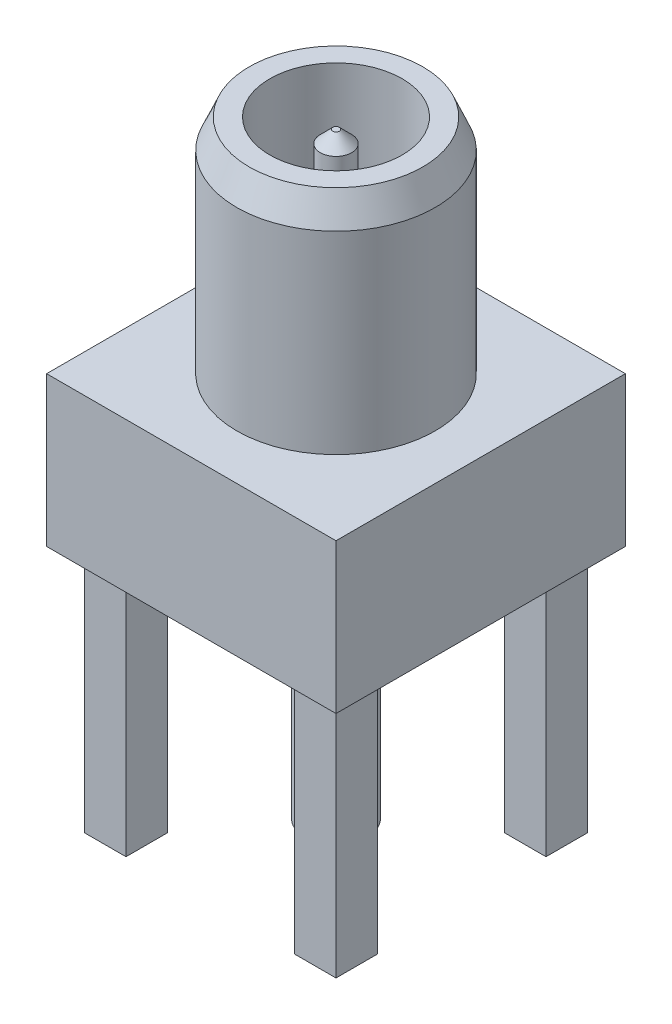
ISO-10303-21;
HEADER;
FILE_DESCRIPTION(('STEP AP214'),'2;1');
FILE_NAME('part.step','',(''),(''),'','','');
FILE_SCHEMA(('AUTOMOTIVE_DESIGN { 1 0 10303 214 1 1 1 1 }'));
ENDSEC;
DATA;
#1=APPLICATION_CONTEXT('core data for automotive mechanical design processes');
#2=APPLICATION_PROTOCOL_DEFINITION('international standard','automotive_design',2000,#1);
#3=PRODUCT_CONTEXT('',#1,'mechanical');
#4=PRODUCT('Part','Part','',(#3));
#5=PRODUCT_RELATED_PRODUCT_CATEGORY('part','',(#4));
#6=PRODUCT_DEFINITION_FORMATION('','',#4);
#7=PRODUCT_DEFINITION_CONTEXT('part definition',#1,'design');
#8=PRODUCT_DEFINITION('design','',#6,#7);
#9=PRODUCT_DEFINITION_SHAPE('','',#8);
#10=(LENGTH_UNIT() NAMED_UNIT(*) SI_UNIT(.MILLI.,.METRE.));
#11=(NAMED_UNIT(*) PLANE_ANGLE_UNIT() SI_UNIT($,.RADIAN.));
#12=(NAMED_UNIT(*) SI_UNIT($,.STERADIAN.) SOLID_ANGLE_UNIT());
#13=UNCERTAINTY_MEASURE_WITH_UNIT(LENGTH_MEASURE(1.E-05),#10,'distance_accuracy_value','');
#14=(GEOMETRIC_REPRESENTATION_CONTEXT(3) GLOBAL_UNCERTAINTY_ASSIGNED_CONTEXT((#13)) GLOBAL_UNIT_ASSIGNED_CONTEXT((#10,
#11,#12)) REPRESENTATION_CONTEXT('',''));
#15=CARTESIAN_POINT('',(0.,0.,0.));
#16=DIRECTION('',(0.,0.,1.));
#17=DIRECTION('',(1.,0.,0.));
#18=AXIS2_PLACEMENT_3D('',#15,#16,#17);
#19=CARTESIAN_POINT('',(0.,-3.,0.));
#20=DIRECTION('',(0.,-1.,0.));
#21=DIRECTION('',(0.,0.,-1.));
#22=AXIS2_PLACEMENT_3D('',#19,#20,#21);
#23=PLANE('',#22);
#24=CARTESIAN_POINT('',(0.,-3.00000000004275,0.));
#25=DIRECTION('',(0.,1.,0.));
#26=DIRECTION('',(0.,0.,1.));
#27=AXIS2_PLACEMENT_3D('',#24,#25,#26);
#28=CIRCLE('',#27,0.231000000042059);
#29=CARTESIAN_POINT('',(0.,-3.00000000004275,0.231000000042059));
#30=VERTEX_POINT('',#29);
#31=EDGE_CURVE('E20',#30,#30,#28,.T.);
#32=ORIENTED_EDGE('',*,*,#31,.F.);
#33=EDGE_LOOP('',(#32));
#34=FACE_BOUND('',#33,.T.);
#35=ADVANCED_FACE('F17',(#34),#23,.T.);
#36=CARTESIAN_POINT('',(0.,-2.85000000013724,0.));
#37=DIRECTION('',(0.,1.,0.));
#38=DIRECTION('',(0.,0.,1.));
#39=AXIS2_PLACEMENT_3D('',#36,#37,#38);
#40=CONICAL_SURFACE('',#39,0.380999999947562,0.785398163397448);
#41=ORIENTED_EDGE('',*,*,#31,.T.);
#42=EDGE_LOOP('',(#41));
#43=FACE_BOUND('',#42,.T.);
#44=CARTESIAN_POINT('',(0.,-2.85,0.));
#45=DIRECTION('',(0.,1.,0.));
#46=DIRECTION('',(0.,0.,1.));
#47=AXIS2_PLACEMENT_3D('',#44,#45,#46);
#48=CIRCLE('',#47,0.381);
#49=CARTESIAN_POINT('',(0.,-2.85,0.381));
#50=VERTEX_POINT('',#49);
#51=EDGE_CURVE('E189',#50,#50,#48,.T.);
#52=ORIENTED_EDGE('',*,*,#51,.F.);
#53=EDGE_LOOP('',(#52));
#54=FACE_BOUND('',#53,.T.);
#55=ADVANCED_FACE('F766',(#43,#54),#40,.T.);
#56=CARTESIAN_POINT('',(-7.39999999999999,4.37,0.));
#57=DIRECTION('',(0.,1.,0.));
#58=DIRECTION('',(0.,0.,1.));
#59=AXIS2_PLACEMENT_3D('',#56,#57,#58);
#60=PLANE('',#59);
#61=CARTESIAN_POINT('',(0.,4.36999999999443,0.));
#62=DIRECTION('',(0.,-1.,0.));
#63=DIRECTION('',(0.,0.,-1.));
#64=AXIS2_PLACEMENT_3D('',#61,#62,#63);
#65=CIRCLE('',#64,0.0404999999542125);
#66=CARTESIAN_POINT('',(0.,4.36999999999443,-0.040499999954212));
#67=VERTEX_POINT('',#66);
#68=EDGE_CURVE('E177',#67,#67,#65,.T.);
#69=ORIENTED_EDGE('',*,*,#68,.F.);
#70=EDGE_LOOP('',(#69));
#71=FACE_BOUND('',#70,.T.);
#72=ADVANCED_FACE('F756',(#71),#60,.T.);
#73=CARTESIAN_POINT('',(-1.52,-3.,-1.52000000000002));
#74=DIRECTION('',(1.,0.,0.));
#75=DIRECTION('',(0.,0.,-1.));
#76=AXIS2_PLACEMENT_3D('',#73,#74,#75);
#77=PLANE('',#76);
#78=DIRECTION('',(0.,1.,0.));
#79=VECTOR('',#78,1.);
#80=CARTESIAN_POINT('',(-1.52,-3.,-1.52000000000002));
#81=LINE('',#80,#79);
#82=CARTESIAN_POINT('',(-1.52,0.,-1.52000000000002));
#83=VERTEX_POINT('',#82);
#84=CARTESIAN_POINT('',(-1.52,-3.,-1.52000000000002));
#85=VERTEX_POINT('',#84);
#86=EDGE_CURVE('E152',#83,#85,#81,.F.);
#87=ORIENTED_EDGE('',*,*,#86,.T.);
#88=DIRECTION('',(0.,0.,-1.));
#89=VECTOR('',#88,1.);
#90=CARTESIAN_POINT('',(-1.52,-3.,0.));
#91=LINE('',#90,#89);
#92=CARTESIAN_POINT('',(-1.52,-3.,-1.02000000000002));
#93=VERTEX_POINT('',#92);
#94=EDGE_CURVE('E171',#93,#85,#91,.T.);
#95=ORIENTED_EDGE('',*,*,#94,.F.);
#96=DIRECTION('',(0.,1.,0.));
#97=VECTOR('',#96,1.);
#98=CARTESIAN_POINT('',(-1.52,-3.,-1.02000000000002));
#99=LINE('',#98,#97);
#100=CARTESIAN_POINT('',(-1.52,0.,-1.02000000000002));
#101=VERTEX_POINT('',#100);
#102=EDGE_CURVE('E159',#93,#101,#99,.T.);
#103=ORIENTED_EDGE('',*,*,#102,.T.);
#104=DIRECTION('',(0.,0.,-1.));
#105=VECTOR('',#104,1.);
#106=CARTESIAN_POINT('',(-1.52,0.,-1.52000000000002));
#107=LINE('',#106,#105);
#108=EDGE_CURVE('E155',#83,#101,#107,.F.);
#109=ORIENTED_EDGE('',*,*,#108,.F.);
#110=EDGE_LOOP('',(#87,#95,#103,#109));
#111=FACE_BOUND('',#110,.T.);
#112=ADVANCED_FACE('F157',(#111),#77,.F.);
#113=CARTESIAN_POINT('',(-1.52000000000001,-3.,1.01999999999998));
#114=DIRECTION('',(1.,0.,0.));
#115=DIRECTION('',(0.,0.,-1.));
#116=AXIS2_PLACEMENT_3D('',#113,#114,#115);
#117=PLANE('',#116);
#118=DIRECTION('',(0.,1.,0.));
#119=VECTOR('',#118,1.);
#120=CARTESIAN_POINT('',(-1.52000000000001,-3.,1.01999999999998));
#121=LINE('',#120,#119);
#122=CARTESIAN_POINT('',(-1.52000000000001,0.,1.01999999999998));
#123=VERTEX_POINT('',#122);
#124=CARTESIAN_POINT('',(-1.52000000000001,-3.,1.01999999999998));
#125=VERTEX_POINT('',#124);
#126=EDGE_CURVE('E272',#123,#125,#121,.F.);
#127=ORIENTED_EDGE('',*,*,#126,.T.);
#128=DIRECTION('',(0.,0.,-1.));
#129=VECTOR('',#128,1.);
#130=CARTESIAN_POINT('',(-1.52000000000001,-3.,0.));
#131=LINE('',#130,#129);
#132=CARTESIAN_POINT('',(-1.52000000000001,-3.,1.51999999999998));
#133=VERTEX_POINT('',#132);
#134=EDGE_CURVE('E266',#133,#125,#131,.T.);
#135=ORIENTED_EDGE('',*,*,#134,.F.);
#136=DIRECTION('',(0.,1.,0.));
#137=VECTOR('',#136,1.);
#138=CARTESIAN_POINT('',(-1.52000000000001,-3.,1.51999999999998));
#139=LINE('',#138,#137);
#140=CARTESIAN_POINT('',(-1.52000000000001,0.,1.51999999999998));
#141=VERTEX_POINT('',#140);
#142=EDGE_CURVE('E257',#133,#141,#139,.T.);
#143=ORIENTED_EDGE('',*,*,#142,.T.);
#144=DIRECTION('',(0.,0.,-1.));
#145=VECTOR('',#144,1.);
#146=CARTESIAN_POINT('',(-1.52000000000001,0.,1.01999999999998));
#147=LINE('',#146,#145);
#148=EDGE_CURVE('E162',#123,#141,#147,.F.);
#149=ORIENTED_EDGE('',*,*,#148,.F.);
#150=EDGE_LOOP('',(#127,#135,#143,#149));
#151=FACE_BOUND('',#150,.T.);
#152=ADVANCED_FACE('F736',(#151),#117,.F.);
#153=CARTESIAN_POINT('',(1.01999999999999,-3.,1.02));
#154=DIRECTION('',(1.,0.,0.));
#155=DIRECTION('',(0.,0.,-1.));
#156=AXIS2_PLACEMENT_3D('',#153,#154,#155);
#157=PLANE('',#156);
#158=DIRECTION('',(0.,1.,0.));
#159=VECTOR('',#158,1.);
#160=CARTESIAN_POINT('',(1.01999999999999,-3.,1.02));
#161=LINE('',#160,#159);
#162=CARTESIAN_POINT('',(1.01999999999999,0.,1.02));
#163=VERTEX_POINT('',#162);
#164=CARTESIAN_POINT('',(1.01999999999999,-3.,1.02));
#165=VERTEX_POINT('',#164);
#166=EDGE_CURVE('E253',#163,#165,#161,.F.);
#167=ORIENTED_EDGE('',*,*,#166,.T.);
#168=DIRECTION('',(0.,0.,-1.));
#169=VECTOR('',#168,1.);
#170=CARTESIAN_POINT('',(1.01999999999999,-3.,0.));
#171=LINE('',#170,#169);
#172=CARTESIAN_POINT('',(1.01999999999999,-3.,1.52));
#173=VERTEX_POINT('',#172);
#174=EDGE_CURVE('E247',#173,#165,#171,.T.);
#175=ORIENTED_EDGE('',*,*,#174,.F.);
#176=DIRECTION('',(0.,1.,0.));
#177=VECTOR('',#176,1.);
#178=CARTESIAN_POINT('',(1.01999999999999,-3.,1.52));
#179=LINE('',#178,#177);
#180=CARTESIAN_POINT('',(1.01999999999999,0.,1.52));
#181=VERTEX_POINT('',#180);
#182=EDGE_CURVE('E231',#173,#181,#179,.T.);
#183=ORIENTED_EDGE('',*,*,#182,.T.);
#184=DIRECTION('',(0.,0.,-1.));
#185=VECTOR('',#184,1.);
#186=CARTESIAN_POINT('',(1.01999999999999,0.,1.02));
#187=LINE('',#186,#185);
#188=EDGE_CURVE('E190',#163,#181,#187,.F.);
#189=ORIENTED_EDGE('',*,*,#188,.F.);
#190=EDGE_LOOP('',(#167,#175,#183,#189));
#191=FACE_BOUND('',#190,.T.);
#192=ADVANCED_FACE('F370',(#191),#157,.F.);
#193=CARTESIAN_POINT('',(0.,-3.,0.));
#194=DIRECTION('',(0.,1.,0.));
#195=DIRECTION('',(0.,0.,1.));
#196=AXIS2_PLACEMENT_3D('',#193,#194,#195);
#197=CYLINDRICAL_SURFACE('',#196,0.381);
#198=CARTESIAN_POINT('',(0.,0.00100000000000013,0.));
#199=DIRECTION('',(0.,1.,0.));
#200=DIRECTION('',(0.,0.,1.));
#201=AXIS2_PLACEMENT_3D('',#198,#199,#200);
#202=CIRCLE('',#201,0.381);
#203=CARTESIAN_POINT('',(0.,0.00100000000000013,0.381));
#204=VERTEX_POINT('',#203);
#205=EDGE_CURVE('E223',#204,#204,#202,.T.);
#206=ORIENTED_EDGE('',*,*,#205,.F.);
#207=EDGE_LOOP('',(#206));
#208=FACE_BOUND('',#207,.T.);
#209=ORIENTED_EDGE('',*,*,#51,.T.);
#210=EDGE_LOOP('',(#209));
#211=FACE_BOUND('',#210,.T.);
#212=ADVANCED_FACE('F716',(#208,#211),#197,.T.);
#213=CARTESIAN_POINT('',(1.02,-3.,-1.52));
#214=DIRECTION('',(1.,0.,0.));
#215=DIRECTION('',(0.,0.,-1.));
#216=AXIS2_PLACEMENT_3D('',#213,#214,#215);
#217=PLANE('',#216);
#218=DIRECTION('',(0.,1.,0.));
#219=VECTOR('',#218,1.);
#220=CARTESIAN_POINT('',(1.02,-3.,-1.52));
#221=LINE('',#220,#219);
#222=CARTESIAN_POINT('',(1.02,0.,-1.52));
#223=VERTEX_POINT('',#222);
#224=CARTESIAN_POINT('',(1.02,-3.,-1.52));
#225=VERTEX_POINT('',#224);
#226=EDGE_CURVE('E225',#223,#225,#221,.F.);
#227=ORIENTED_EDGE('',*,*,#226,.T.);
#228=DIRECTION('',(0.,0.,-1.));
#229=VECTOR('',#228,1.);
#230=CARTESIAN_POINT('',(1.02,-3.,0.));
#231=LINE('',#230,#229);
#232=CARTESIAN_POINT('',(1.02,-3.,-1.02));
#233=VERTEX_POINT('',#232);
#234=EDGE_CURVE('E328',#233,#225,#231,.T.);
#235=ORIENTED_EDGE('',*,*,#234,.F.);
#236=DIRECTION('',(0.,1.,0.));
#237=VECTOR('',#236,1.);
#238=CARTESIAN_POINT('',(1.02,-3.,-1.02));
#239=LINE('',#238,#237);
#240=CARTESIAN_POINT('',(1.02,0.,-1.02));
#241=VERTEX_POINT('',#240);
#242=EDGE_CURVE('E319',#233,#241,#239,.T.);
#243=ORIENTED_EDGE('',*,*,#242,.T.);
#244=DIRECTION('',(0.,0.,-1.));
#245=VECTOR('',#244,1.);
#246=CARTESIAN_POINT('',(1.02,0.,-1.52));
#247=LINE('',#246,#245);
#248=EDGE_CURVE('E180',#223,#241,#247,.F.);
#249=ORIENTED_EDGE('',*,*,#248,.F.);
#250=EDGE_LOOP('',(#227,#235,#243,#249));
#251=FACE_BOUND('',#250,.T.);
#252=ADVANCED_FACE('F341',(#251),#217,.F.);
#253=CARTESIAN_POINT('',(0.,4.22000083335661,0.));
#254=DIRECTION('',(0.,-1.,0.));
#255=DIRECTION('',(0.,0.,-1.));
#256=AXIS2_PLACEMENT_3D('',#253,#254,#255);
#257=CONICAL_SURFACE('',#256,0.1899999999182,0.783731493612322);
#258=CARTESIAN_POINT('',(0.,4.22000083333565,0.));
#259=DIRECTION('',(0.,-1.,0.));
#260=DIRECTION('',(0.,0.,-1.));
#261=AXIS2_PLACEMENT_3D('',#258,#259,#260);
#262=CIRCLE('',#261,0.19);
#263=CARTESIAN_POINT('',(0.,4.22000083333565,-0.189999999939087));
#264=VERTEX_POINT('',#263);
#265=EDGE_CURVE('E183',#264,#264,#262,.T.);
#266=CARTESIAN_POINT('',(0.,4.22000083333565,-0.189999999939087));
#267=CARTESIAN_POINT('',(0.,4.22156332465501,-0.188442708272578));
#268=CARTESIAN_POINT('',(0.,4.22312581597437,-0.186885416606069));
#269=CARTESIAN_POINT('',(0.,4.2262507986131,-0.183770833273051));
#270=CARTESIAN_POINT('',(0.,4.22781328993246,-0.182213541606542));
#271=CARTESIAN_POINT('',(0.,4.23093827257119,-0.179098958273523));
#272=CARTESIAN_POINT('',(0.,4.23250076389055,-0.177541666607014));
#273=CARTESIAN_POINT('',(0.,4.23562574652927,-0.174427083273996));
#274=CARTESIAN_POINT('',(0.,4.23718823784864,-0.172869791607487));
#275=CARTESIAN_POINT('',(0.,4.24031322048736,-0.169755208274469));
#276=CARTESIAN_POINT('',(0.,4.24187571180672,-0.168197916607959));
#277=CARTESIAN_POINT('',(0.,4.24500069444545,-0.165083333274941));
#278=CARTESIAN_POINT('',(0.,4.24656318576481,-0.163526041608432));
#279=CARTESIAN_POINT('',(0.,4.24968816840353,-0.160411458275414));
#280=CARTESIAN_POINT('',(0.,4.2512506597229,-0.158854166608905));
#281=CARTESIAN_POINT('',(0.,4.25437564236162,-0.155739583275887));
#282=CARTESIAN_POINT('',(0.,4.25593813368098,-0.154182291609377));
#283=CARTESIAN_POINT('',(0.,4.25906311631971,-0.151067708276359));
#284=CARTESIAN_POINT('',(0.,4.26062560763907,-0.14951041660985));
#285=CARTESIAN_POINT('',(0.,4.2637505902778,-0.146395833276832));
#286=CARTESIAN_POINT('',(0.,4.26531308159716,-0.144838541610323));
#287=CARTESIAN_POINT('',(0.,4.26843806423588,-0.141723958277304));
#288=CARTESIAN_POINT('',(0.,4.27000055555525,-0.140166666610795));
#289=CARTESIAN_POINT('',(0.,4.27312553819397,-0.137052083277777));
#290=CARTESIAN_POINT('',(0.,4.27468802951333,-0.135494791611268));
#291=CARTESIAN_POINT('',(0.,4.27781301215206,-0.13238020827825));
#292=CARTESIAN_POINT('',(0.,4.27937550347142,-0.130822916611741));
#293=CARTESIAN_POINT('',(0.,4.28250048611014,-0.127708333278722));
#294=CARTESIAN_POINT('',(0.,4.28406297742951,-0.126151041612213));
#295=CARTESIAN_POINT('',(0.,4.28718796006823,-0.123036458279195));
#296=CARTESIAN_POINT('',(0.,4.28875045138759,-0.121479166612686));
#297=CARTESIAN_POINT('',(0.,4.29187543402632,-0.118364583279668));
#298=CARTESIAN_POINT('',(0.,4.29343792534568,-0.116807291613159));
#299=CARTESIAN_POINT('',(0.,4.2965629079844,-0.113692708280141));
#300=CARTESIAN_POINT('',(0.,4.29812539930377,-0.112135416613631));
#301=CARTESIAN_POINT('',(0.,4.30125038194249,-0.109020833280613));
#302=CARTESIAN_POINT('',(0.,4.30281287326186,-0.107463541614104));
#303=CARTESIAN_POINT('',(0.,4.30593785590058,-0.104348958281086));
#304=CARTESIAN_POINT('',(0.,4.30750034721994,-0.102791666614577));
#305=CARTESIAN_POINT('',(0.,4.31062532985867,-0.0996770832815584));
#306=CARTESIAN_POINT('',(0.,4.31218782117803,-0.0981197916150493));
#307=CARTESIAN_POINT('',(0.,4.31531280381675,-0.095005208282031));
#308=CARTESIAN_POINT('',(0.,4.31687529513612,-0.0934479166155219));
#309=CARTESIAN_POINT('',(0.,4.32000027777484,-0.0903333332825037));
#310=CARTESIAN_POINT('',(0.,4.3215627690942,-0.0887760416159946));
#311=CARTESIAN_POINT('',(0.,4.32468775173293,-0.0856614582829763));
#312=CARTESIAN_POINT('',(0.,4.32625024305229,-0.0841041666164672));
#313=CARTESIAN_POINT('',(0.,4.32937522569101,-0.080989583283449));
#314=CARTESIAN_POINT('',(0.,4.33093771701038,-0.0794322916169399));
#315=CARTESIAN_POINT('',(0.,4.3340626996491,-0.0763177082839217));
#316=CARTESIAN_POINT('',(0.,4.33562519096846,-0.0747604166174125));
#317=CARTESIAN_POINT('',(0.,4.33875017360719,-0.0716458332843943));
#318=CARTESIAN_POINT('',(0.,4.34031266492655,-0.0700885416178852));
#319=CARTESIAN_POINT('',(0.,4.34343764756527,-0.066973958284867));
#320=CARTESIAN_POINT('',(0.,4.34500013888464,-0.0654166666183579));
#321=CARTESIAN_POINT('',(0.,4.34812512152336,-0.0623020832853396));
#322=CARTESIAN_POINT('',(0.,4.34968761284272,-0.0607447916188305));
#323=CARTESIAN_POINT('',(0.,4.35281259548145,-0.0576302082858123));
#324=CARTESIAN_POINT('',(0.,4.35437508680081,-0.0560729166193032));
#325=CARTESIAN_POINT('',(0.,4.35750006943953,-0.0529583332862849));
#326=CARTESIAN_POINT('',(0.,4.3590625607589,-0.0514010416197758));
#327=CARTESIAN_POINT('',(0.,4.36218754339762,-0.0482864582867576));
#328=CARTESIAN_POINT('',(0.,4.36375003471699,-0.0467291666202485));
#329=CARTESIAN_POINT('',(0.,4.36687501735571,-0.0436145832872302));
#330=CARTESIAN_POINT('',(0.,4.36843750867507,-0.0420572916207211));
#331=CARTESIAN_POINT('',(0.,4.36999999999443,-0.040499999954212));
#332=B_SPLINE_CURVE_WITH_KNOTS('',3,(#266,#267,#268,#269,#270,#271,#272,#273,#274,#275,#276,
#277,#278,#279,#280,#281,#282,#283,#284,#285,#286,#287,#288,#289,#290,#291,#292,#293,#294,#295,
#296,#297,#298,#299,#300,#301,#302,#303,#304,#305,#306,#307,#308,#309,#310,#311,#312,#313,#314,
#315,#316,#317,#318,#319,#320,#321,#322,#323,#324,#325,#326,#327,#328,#329,#330,#331),
.UNSPECIFIED.,.F.,.F.,(4,2,2,2,2,2,2,2,2,2,2,2,2,2,2,2,2,2,2,2,2,2,2,2,2,2,2,2,2,2,2,2,4),(0.,
0.00661806830721473,0.0132361366144288,0.0198542049216429,0.026472273228857,0.0330903415360712,
0.0397084098432853,0.0463264781504994,0.0529445464577135,0.0595626147649276,0.0661806830721417,
0.0727987513793558,0.0794168196865699,0.086034887993784,0.0926529563009982,0.0992710246082123,
0.105889092915427,0.112507161222641,0.119125229529855,0.125743297837069,0.132361366144283,
0.138979434451498,0.145597502758712,0.152215571065926,0.15883363937314,0.165451707680354,
0.172069775987568,0.178687844294782,0.185305912601996,0.19192398090921,0.198542049216425,
0.205160117523639,0.211778185830853),.UNSPECIFIED.);
#333=EDGE_CURVE('BSEAM704',#264,#67,#332,.T.);
#334=ORIENTED_EDGE('',*,*,#265,.F.);
#335=ORIENTED_EDGE('',*,*,#68,.T.);
#336=ORIENTED_EDGE('',*,*,#333,.T.);
#337=ORIENTED_EDGE('',*,*,#333,.F.);
#338=EDGE_LOOP('',(#334,#336,#335,#337));
#339=FACE_BOUND('',#338,.T.);
#340=ADVANCED_FACE('F704',(#339),#257,.T.);
#341=CARTESIAN_POINT('',(-1.02,-3.,-1.52000000000002));
#342=DIRECTION('',(0.,0.,1.));
#343=DIRECTION('',(1.,0.,0.));
#344=AXIS2_PLACEMENT_3D('',#341,#342,#343);
#345=PLANE('',#344);
#346=DIRECTION('',(0.,1.,0.));
#347=VECTOR('',#346,1.);
#348=CARTESIAN_POINT('',(-1.02,-3.,-1.52000000000002));
#349=LINE('',#348,#347);
#350=CARTESIAN_POINT('',(-1.02,0.,-1.52000000000002));
#351=VERTEX_POINT('',#350);
#352=CARTESIAN_POINT('',(-1.02,-3.,-1.52000000000002));
#353=VERTEX_POINT('',#352);
#354=EDGE_CURVE('E186',#351,#353,#349,.F.);
#355=ORIENTED_EDGE('',*,*,#354,.T.);
#356=DIRECTION('',(1.,0.,0.));
#357=VECTOR('',#356,1.);
#358=CARTESIAN_POINT('',(0.,-3.,-1.52000000000002));
#359=LINE('',#358,#357);
#360=EDGE_CURVE('E175',#85,#353,#359,.T.);
#361=ORIENTED_EDGE('',*,*,#360,.F.);
#362=ORIENTED_EDGE('',*,*,#86,.F.);
#363=DIRECTION('',(1.,0.,0.));
#364=VECTOR('',#363,1.);
#365=CARTESIAN_POINT('',(-1.02,0.,-1.52000000000002));
#366=LINE('',#365,#364);
#367=EDGE_CURVE('E165',#351,#83,#366,.F.);
#368=ORIENTED_EDGE('',*,*,#367,.F.);
#369=EDGE_LOOP('',(#355,#361,#362,#368));
#370=FACE_BOUND('',#369,.T.);
#371=ADVANCED_FACE('F173',(#370),#345,.F.);
#372=CARTESIAN_POINT('',(0.,-3.,0.));
#373=DIRECTION('',(0.,-1.,0.));
#374=DIRECTION('',(0.,0.,-1.));
#375=AXIS2_PLACEMENT_3D('',#372,#373,#374);
#376=PLANE('',#375);
#377=DIRECTION('',(0.,0.,1.));
#378=VECTOR('',#377,1.);
#379=CARTESIAN_POINT('',(-1.02,-3.,-1.52000000000002));
#380=LINE('',#379,#378);
#381=CARTESIAN_POINT('',(-1.02,-3.,-1.02000000000002));
#382=VERTEX_POINT('',#381);
#383=EDGE_CURVE('E284',#353,#382,#380,.T.);
#384=ORIENTED_EDGE('',*,*,#383,.T.);
#385=DIRECTION('',(-1.,0.,0.));
#386=VECTOR('',#385,1.);
#387=CARTESIAN_POINT('',(-1.02,-3.,-1.02000000000002));
#388=LINE('',#387,#386);
#389=EDGE_CURVE('E277',#382,#93,#388,.T.);
#390=ORIENTED_EDGE('',*,*,#389,.T.);
#391=ORIENTED_EDGE('',*,*,#94,.T.);
#392=ORIENTED_EDGE('',*,*,#360,.T.);
#393=EDGE_LOOP('',(#384,#390,#391,#392));
#394=FACE_BOUND('',#393,.T.);
#395=ADVANCED_FACE('F281',(#394),#376,.T.);
#396=CARTESIAN_POINT('',(-1.02,-3.,-1.02000000000002));
#397=DIRECTION('',(0.,0.,-1.));
#398=DIRECTION('',(-1.,0.,0.));
#399=AXIS2_PLACEMENT_3D('',#396,#397,#398);
#400=PLANE('',#399);
#401=ORIENTED_EDGE('',*,*,#102,.F.);
#402=ORIENTED_EDGE('',*,*,#389,.F.);
#403=DIRECTION('',(0.,1.,0.));
#404=VECTOR('',#403,1.);
#405=CARTESIAN_POINT('',(-1.02,-3.,-1.02000000000002));
#406=LINE('',#405,#404);
#407=CARTESIAN_POINT('',(-1.02,0.,-1.02000000000002));
#408=VERTEX_POINT('',#407);
#409=EDGE_CURVE('E289',#382,#408,#406,.T.);
#410=ORIENTED_EDGE('',*,*,#409,.T.);
#411=DIRECTION('',(-1.,0.,0.));
#412=VECTOR('',#411,1.);
#413=CARTESIAN_POINT('',(-1.02,0.,-1.02000000000002));
#414=LINE('',#413,#412);
#415=EDGE_CURVE('E274',#101,#408,#414,.F.);
#416=ORIENTED_EDGE('',*,*,#415,.F.);
#417=EDGE_LOOP('',(#401,#402,#410,#416));
#418=FACE_BOUND('',#417,.T.);
#419=ADVANCED_FACE('F288',(#418),#400,.F.);
#420=CARTESIAN_POINT('',(-1.02000000000001,-3.,1.01999999999998));
#421=DIRECTION('',(0.,0.,1.));
#422=DIRECTION('',(1.,0.,0.));
#423=AXIS2_PLACEMENT_3D('',#420,#421,#422);
#424=PLANE('',#423);
#425=DIRECTION('',(0.,1.,0.));
#426=VECTOR('',#425,1.);
#427=CARTESIAN_POINT('',(-1.02000000000001,-3.,1.01999999999998));
#428=LINE('',#427,#426);
#429=CARTESIAN_POINT('',(-1.02000000000001,0.,1.01999999999998));
#430=VERTEX_POINT('',#429);
#431=CARTESIAN_POINT('',(-1.02000000000001,-3.,1.01999999999998));
#432=VERTEX_POINT('',#431);
#433=EDGE_CURVE('E291',#430,#432,#428,.F.);
#434=ORIENTED_EDGE('',*,*,#433,.T.);
#435=DIRECTION('',(1.,0.,0.));
#436=VECTOR('',#435,1.);
#437=CARTESIAN_POINT('',(0.,-3.,1.01999999999998));
#438=LINE('',#437,#436);
#439=EDGE_CURVE('E263',#125,#432,#438,.T.);
#440=ORIENTED_EDGE('',*,*,#439,.F.);
#441=ORIENTED_EDGE('',*,*,#126,.F.);
#442=DIRECTION('',(1.,0.,0.));
#443=VECTOR('',#442,1.);
#444=CARTESIAN_POINT('',(-1.02000000000001,0.,1.01999999999998));
#445=LINE('',#444,#443);
#446=EDGE_CURVE('E269',#430,#123,#445,.F.);
#447=ORIENTED_EDGE('',*,*,#446,.F.);
#448=EDGE_LOOP('',(#434,#440,#441,#447));
#449=FACE_BOUND('',#448,.T.);
#450=ADVANCED_FACE('F665',(#449),#424,.F.);
#451=CARTESIAN_POINT('',(0.,-3.,0.));
#452=DIRECTION('',(0.,-1.,0.));
#453=DIRECTION('',(0.,0.,-1.));
#454=AXIS2_PLACEMENT_3D('',#451,#452,#453);
#455=PLANE('',#454);
#456=DIRECTION('',(0.,0.,1.));
#457=VECTOR('',#456,1.);
#458=CARTESIAN_POINT('',(-1.02000000000001,-3.,1.01999999999998));
#459=LINE('',#458,#457);
#460=CARTESIAN_POINT('',(-1.02000000000001,-3.,1.51999999999998));
#461=VERTEX_POINT('',#460);
#462=EDGE_CURVE('E313',#432,#461,#459,.T.);
#463=ORIENTED_EDGE('',*,*,#462,.T.);
#464=DIRECTION('',(-1.,0.,0.));
#465=VECTOR('',#464,1.);
#466=CARTESIAN_POINT('',(-1.02000000000001,-3.,1.51999999999998));
#467=LINE('',#466,#465);
#468=EDGE_CURVE('E260',#461,#133,#467,.T.);
#469=ORIENTED_EDGE('',*,*,#468,.T.);
#470=ORIENTED_EDGE('',*,*,#134,.T.);
#471=ORIENTED_EDGE('',*,*,#439,.T.);
#472=EDGE_LOOP('',(#463,#469,#470,#471));
#473=FACE_BOUND('',#472,.T.);
#474=ADVANCED_FACE('F654',(#473),#455,.T.);
#475=CARTESIAN_POINT('',(-1.02000000000001,-3.,1.51999999999998));
#476=DIRECTION('',(0.,0.,-1.));
#477=DIRECTION('',(-1.,0.,0.));
#478=AXIS2_PLACEMENT_3D('',#475,#476,#477);
#479=PLANE('',#478);
#480=ORIENTED_EDGE('',*,*,#142,.F.);
#481=ORIENTED_EDGE('',*,*,#468,.F.);
#482=DIRECTION('',(0.,1.,0.));
#483=VECTOR('',#482,1.);
#484=CARTESIAN_POINT('',(-1.02000000000001,-3.,1.51999999999998));
#485=LINE('',#484,#483);
#486=CARTESIAN_POINT('',(-1.02000000000001,0.,1.51999999999998));
#487=VERTEX_POINT('',#486);
#488=EDGE_CURVE('E310',#461,#487,#485,.T.);
#489=ORIENTED_EDGE('',*,*,#488,.T.);
#490=DIRECTION('',(-1.,0.,0.));
#491=VECTOR('',#490,1.);
#492=CARTESIAN_POINT('',(-1.02000000000001,0.,1.51999999999998));
#493=LINE('',#492,#491);
#494=EDGE_CURVE('E255',#141,#487,#493,.F.);
#495=ORIENTED_EDGE('',*,*,#494,.F.);
#496=EDGE_LOOP('',(#480,#481,#489,#495));
#497=FACE_BOUND('',#496,.T.);
#498=ADVANCED_FACE('F644',(#497),#479,.F.);
#499=CARTESIAN_POINT('',(1.51999999999999,-3.,1.02));
#500=DIRECTION('',(0.,0.,1.));
#501=DIRECTION('',(1.,0.,0.));
#502=AXIS2_PLACEMENT_3D('',#499,#500,#501);
#503=PLANE('',#502);
#504=DIRECTION('',(0.,1.,0.));
#505=VECTOR('',#504,1.);
#506=CARTESIAN_POINT('',(1.51999999999999,-3.,1.02));
#507=LINE('',#506,#505);
#508=CARTESIAN_POINT('',(1.51999999999999,0.,1.02));
#509=VERTEX_POINT('',#508);
#510=CARTESIAN_POINT('',(1.51999999999999,-3.,1.02));
#511=VERTEX_POINT('',#510);
#512=EDGE_CURVE('E308',#509,#511,#507,.F.);
#513=ORIENTED_EDGE('',*,*,#512,.T.);
#514=DIRECTION('',(1.,0.,0.));
#515=VECTOR('',#514,1.);
#516=CARTESIAN_POINT('',(0.,-3.,1.02));
#517=LINE('',#516,#515);
#518=EDGE_CURVE('E244',#165,#511,#517,.T.);
#519=ORIENTED_EDGE('',*,*,#518,.F.);
#520=ORIENTED_EDGE('',*,*,#166,.F.);
#521=DIRECTION('',(1.,0.,0.));
#522=VECTOR('',#521,1.);
#523=CARTESIAN_POINT('',(1.51999999999999,0.,1.02));
#524=LINE('',#523,#522);
#525=EDGE_CURVE('E250',#509,#163,#524,.F.);
#526=ORIENTED_EDGE('',*,*,#525,.F.);
#527=EDGE_LOOP('',(#513,#519,#520,#526));
#528=FACE_BOUND('',#527,.T.);
#529=ADVANCED_FACE('F364',(#528),#503,.F.);
#530=CARTESIAN_POINT('',(0.,-3.,0.));
#531=DIRECTION('',(0.,-1.,0.));
#532=DIRECTION('',(0.,0.,-1.));
#533=AXIS2_PLACEMENT_3D('',#530,#531,#532);
#534=PLANE('',#533);
#535=DIRECTION('',(0.,0.,1.));
#536=VECTOR('',#535,1.);
#537=CARTESIAN_POINT('',(1.51999999999999,-3.,1.02));
#538=LINE('',#537,#536);
#539=CARTESIAN_POINT('',(1.51999999999999,-3.,1.52));
#540=VERTEX_POINT('',#539);
#541=EDGE_CURVE('E306',#511,#540,#538,.T.);
#542=ORIENTED_EDGE('',*,*,#541,.T.);
#543=DIRECTION('',(-1.,0.,0.));
#544=VECTOR('',#543,1.);
#545=CARTESIAN_POINT('',(1.51999999999999,-3.,1.52));
#546=LINE('',#545,#544);
#547=EDGE_CURVE('E238',#540,#173,#546,.T.);
#548=ORIENTED_EDGE('',*,*,#547,.T.);
#549=ORIENTED_EDGE('',*,*,#174,.T.);
#550=ORIENTED_EDGE('',*,*,#518,.T.);
#551=EDGE_LOOP('',(#542,#548,#549,#550));
#552=FACE_BOUND('',#551,.T.);
#553=ADVANCED_FACE('F366',(#552),#534,.T.);
#554=CARTESIAN_POINT('',(1.51999999999999,-3.,1.52));
#555=DIRECTION('',(0.,0.,-1.));
#556=DIRECTION('',(-1.,0.,0.));
#557=AXIS2_PLACEMENT_3D('',#554,#555,#556);
#558=PLANE('',#557);
#559=ORIENTED_EDGE('',*,*,#182,.F.);
#560=ORIENTED_EDGE('',*,*,#547,.F.);
#561=DIRECTION('',(0.,1.,0.));
#562=VECTOR('',#561,1.);
#563=CARTESIAN_POINT('',(1.51999999999999,-3.,1.52));
#564=LINE('',#563,#562);
#565=CARTESIAN_POINT('',(1.51999999999999,0.,1.52));
#566=VERTEX_POINT('',#565);
#567=EDGE_CURVE('E222',#540,#566,#564,.T.);
#568=ORIENTED_EDGE('',*,*,#567,.T.);
#569=DIRECTION('',(-1.,0.,0.));
#570=VECTOR('',#569,1.);
#571=CARTESIAN_POINT('',(1.51999999999999,0.,1.52));
#572=LINE('',#571,#570);
#573=EDGE_CURVE('E226',#181,#566,#572,.F.);
#574=ORIENTED_EDGE('',*,*,#573,.F.);
#575=EDGE_LOOP('',(#559,#560,#568,#574));
#576=FACE_BOUND('',#575,.T.);
#577=ADVANCED_FACE('F372',(#576),#558,.F.);
#578=CARTESIAN_POINT('',(0.,0.001,0.));
#579=DIRECTION('',(0.,-1.,0.));
#580=DIRECTION('',(0.,0.,-1.));
#581=AXIS2_PLACEMENT_3D('',#578,#579,#580);
#582=PLANE('',#581);
#583=ORIENTED_EDGE('',*,*,#205,.T.);
#584=EDGE_LOOP('',(#583));
#585=FACE_BOUND('',#584,.T.);
#586=CARTESIAN_POINT('',(0.,0.001,0.));
#587=DIRECTION('',(0.,-1.,0.));
#588=DIRECTION('',(0.,0.,-1.));
#589=AXIS2_PLACEMENT_3D('',#586,#587,#588);
#590=CIRCLE('',#589,1.);
#591=CARTESIAN_POINT('',(0.,0.001,-1.));
#592=VERTEX_POINT('',#591);
#593=EDGE_CURVE('E218',#592,#592,#590,.T.);
#594=ORIENTED_EDGE('',*,*,#593,.T.);
#595=EDGE_LOOP('',(#594));
#596=FACE_BOUND('',#595,.T.);
#597=ADVANCED_FACE('F374',(#585,#596),#582,.T.);
#598=CARTESIAN_POINT('',(1.52,-3.,-1.52));
#599=DIRECTION('',(0.,0.,1.));
#600=DIRECTION('',(1.,0.,0.));
#601=AXIS2_PLACEMENT_3D('',#598,#599,#600);
#602=PLANE('',#601);
#603=DIRECTION('',(0.,1.,0.));
#604=VECTOR('',#603,1.);
#605=CARTESIAN_POINT('',(1.52,-3.,-1.52));
#606=LINE('',#605,#604);
#607=CARTESIAN_POINT('',(1.52,0.,-1.52));
#608=VERTEX_POINT('',#607);
#609=CARTESIAN_POINT('',(1.52,-3.,-1.52));
#610=VERTEX_POINT('',#609);
#611=EDGE_CURVE('E221',#608,#610,#606,.F.);
#612=ORIENTED_EDGE('',*,*,#611,.T.);
#613=DIRECTION('',(1.,0.,0.));
#614=VECTOR('',#613,1.);
#615=CARTESIAN_POINT('',(0.,-3.,-1.52));
#616=LINE('',#615,#614);
#617=EDGE_CURVE('E325',#225,#610,#616,.T.);
#618=ORIENTED_EDGE('',*,*,#617,.F.);
#619=ORIENTED_EDGE('',*,*,#226,.F.);
#620=DIRECTION('',(1.,0.,0.));
#621=VECTOR('',#620,1.);
#622=CARTESIAN_POINT('',(1.52,0.,-1.52));
#623=LINE('',#622,#621);
#624=EDGE_CURVE('E229',#608,#223,#623,.F.);
#625=ORIENTED_EDGE('',*,*,#624,.F.);
#626=EDGE_LOOP('',(#612,#618,#619,#625));
#627=FACE_BOUND('',#626,.T.);
#628=ADVANCED_FACE('F339',(#627),#602,.F.);
#629=CARTESIAN_POINT('',(0.,-3.,0.));
#630=DIRECTION('',(0.,-1.,0.));
#631=DIRECTION('',(0.,0.,-1.));
#632=AXIS2_PLACEMENT_3D('',#629,#630,#631);
#633=PLANE('',#632);
#634=DIRECTION('',(0.,0.,1.));
#635=VECTOR('',#634,1.);
#636=CARTESIAN_POINT('',(1.52,-3.,-1.52));
#637=LINE('',#636,#635);
#638=CARTESIAN_POINT('',(1.52,-3.,-1.02));
#639=VERTEX_POINT('',#638);
#640=EDGE_CURVE('E302',#610,#639,#637,.T.);
#641=ORIENTED_EDGE('',*,*,#640,.T.);
#642=DIRECTION('',(-1.,0.,0.));
#643=VECTOR('',#642,1.);
#644=CARTESIAN_POINT('',(1.52,-3.,-1.02));
#645=LINE('',#644,#643);
#646=EDGE_CURVE('E322',#639,#233,#645,.T.);
#647=ORIENTED_EDGE('',*,*,#646,.T.);
#648=ORIENTED_EDGE('',*,*,#234,.T.);
#649=ORIENTED_EDGE('',*,*,#617,.T.);
#650=EDGE_LOOP('',(#641,#647,#648,#649));
#651=FACE_BOUND('',#650,.T.);
#652=ADVANCED_FACE('F449',(#651),#633,.T.);
#653=CARTESIAN_POINT('',(1.52,-3.,-1.02));
#654=DIRECTION('',(0.,0.,-1.));
#655=DIRECTION('',(-1.,0.,0.));
#656=AXIS2_PLACEMENT_3D('',#653,#654,#655);
#657=PLANE('',#656);
#658=ORIENTED_EDGE('',*,*,#242,.F.);
#659=ORIENTED_EDGE('',*,*,#646,.F.);
#660=DIRECTION('',(0.,1.,0.));
#661=VECTOR('',#660,1.);
#662=CARTESIAN_POINT('',(1.52,-3.,-1.02));
#663=LINE('',#662,#661);
#664=CARTESIAN_POINT('',(1.52,0.,-1.02));
#665=VERTEX_POINT('',#664);
#666=EDGE_CURVE('E217',#639,#665,#663,.T.);
#667=ORIENTED_EDGE('',*,*,#666,.T.);
#668=DIRECTION('',(-1.,0.,0.));
#669=VECTOR('',#668,1.);
#670=CARTESIAN_POINT('',(1.52,0.,-1.02));
#671=LINE('',#670,#669);
#672=EDGE_CURVE('E187',#241,#665,#671,.F.);
#673=ORIENTED_EDGE('',*,*,#672,.F.);
#674=EDGE_LOOP('',(#658,#659,#667,#673));
#675=FACE_BOUND('',#674,.T.);
#676=ADVANCED_FACE('F346',(#675),#657,.F.);
#677=CARTESIAN_POINT('',(0.,0.,0.));
#678=DIRECTION('',(0.,-1.,0.));
#679=DIRECTION('',(0.,0.,-1.));
#680=AXIS2_PLACEMENT_3D('',#677,#678,#679);
#681=CYLINDRICAL_SURFACE('',#680,0.19);
#682=CARTESIAN_POINT('',(0.,3.05000000000001,0.));
#683=DIRECTION('',(0.,-1.,0.));
#684=DIRECTION('',(0.,0.,-1.));
#685=AXIS2_PLACEMENT_3D('',#682,#683,#684);
#686=CIRCLE('',#685,0.19);
#687=CARTESIAN_POINT('',(0.,3.05000000000001,-0.19));
#688=VERTEX_POINT('',#687);
#689=EDGE_CURVE('E214',#688,#688,#686,.T.);
#690=ORIENTED_EDGE('',*,*,#689,.F.);
#691=EDGE_LOOP('',(#690));
#692=FACE_BOUND('',#691,.T.);
#693=ORIENTED_EDGE('',*,*,#265,.T.);
#694=EDGE_LOOP('',(#693));
#695=FACE_BOUND('',#694,.T.);
#696=ADVANCED_FACE('F443',(#692,#695),#681,.T.);
#697=CARTESIAN_POINT('',(-1.02,-3.,-1.52000000000002));
#698=DIRECTION('',(-1.,0.,0.));
#699=DIRECTION('',(0.,0.,1.));
#700=AXIS2_PLACEMENT_3D('',#697,#698,#699);
#701=PLANE('',#700);
#702=ORIENTED_EDGE('',*,*,#409,.F.);
#703=ORIENTED_EDGE('',*,*,#383,.F.);
#704=ORIENTED_EDGE('',*,*,#354,.F.);
#705=DIRECTION('',(0.,0.,-1.));
#706=VECTOR('',#705,1.);
#707=CARTESIAN_POINT('',(-1.02,0.,0.));
#708=LINE('',#707,#706);
#709=EDGE_CURVE('E168',#408,#351,#708,.T.);
#710=ORIENTED_EDGE('',*,*,#709,.F.);
#711=EDGE_LOOP('',(#702,#703,#704,#710));
#712=FACE_BOUND('',#711,.T.);
#713=ADVANCED_FACE('F293',(#712),#701,.F.);
#714=CARTESIAN_POINT('',(-1.02000000000001,-3.,1.01999999999998));
#715=DIRECTION('',(-1.,0.,0.));
#716=DIRECTION('',(0.,0.,1.));
#717=AXIS2_PLACEMENT_3D('',#714,#715,#716);
#718=PLANE('',#717);
#719=ORIENTED_EDGE('',*,*,#488,.F.);
#720=ORIENTED_EDGE('',*,*,#462,.F.);
#721=ORIENTED_EDGE('',*,*,#433,.F.);
#722=DIRECTION('',(0.,0.,-1.));
#723=VECTOR('',#722,1.);
#724=CARTESIAN_POINT('',(-1.02000000000001,0.,0.));
#725=LINE('',#724,#723);
#726=EDGE_CURVE('E294',#487,#430,#725,.T.);
#727=ORIENTED_EDGE('',*,*,#726,.F.);
#728=EDGE_LOOP('',(#719,#720,#721,#727));
#729=FACE_BOUND('',#728,.T.);
#730=ADVANCED_FACE('F437',(#729),#718,.F.);
#731=CARTESIAN_POINT('',(1.51999999999999,-3.,1.02));
#732=DIRECTION('',(-1.,0.,0.));
#733=DIRECTION('',(0.,0.,1.));
#734=AXIS2_PLACEMENT_3D('',#731,#732,#733);
#735=PLANE('',#734);
#736=ORIENTED_EDGE('',*,*,#567,.F.);
#737=ORIENTED_EDGE('',*,*,#541,.F.);
#738=ORIENTED_EDGE('',*,*,#512,.F.);
#739=DIRECTION('',(0.,0.,-1.));
#740=VECTOR('',#739,1.);
#741=CARTESIAN_POINT('',(1.51999999999999,0.,0.));
#742=LINE('',#741,#740);
#743=EDGE_CURVE('E213',#566,#509,#742,.T.);
#744=ORIENTED_EDGE('',*,*,#743,.F.);
#745=EDGE_LOOP('',(#736,#737,#738,#744));
#746=FACE_BOUND('',#745,.T.);
#747=ADVANCED_FACE('F360',(#746),#735,.F.);
#748=CARTESIAN_POINT('',(0.,0.001,0.));
#749=DIRECTION('',(0.,-1.,0.));
#750=DIRECTION('',(0.,0.,-1.));
#751=AXIS2_PLACEMENT_3D('',#748,#749,#750);
#752=CYLINDRICAL_SURFACE('',#751,1.);
#753=ORIENTED_EDGE('',*,*,#593,.F.);
#754=EDGE_LOOP('',(#753));
#755=FACE_BOUND('',#754,.T.);
#756=CARTESIAN_POINT('',(0.,0.,0.));
#757=DIRECTION('',(0.,-1.,0.));
#758=DIRECTION('',(0.,0.,-1.));
#759=AXIS2_PLACEMENT_3D('',#756,#757,#758);
#760=CIRCLE('',#759,1.);
#761=CARTESIAN_POINT('',(0.,0.,-1.));
#762=VERTEX_POINT('',#761);
#763=EDGE_CURVE('E210',#762,#762,#760,.F.);
#764=ORIENTED_EDGE('',*,*,#763,.F.);
#765=EDGE_LOOP('',(#764));
#766=FACE_BOUND('',#765,.T.);
#767=ADVANCED_FACE('F431',(#755,#766),#752,.F.);
#768=CARTESIAN_POINT('',(1.52,-3.,-1.52));
#769=DIRECTION('',(-1.,0.,0.));
#770=DIRECTION('',(0.,0.,1.));
#771=AXIS2_PLACEMENT_3D('',#768,#769,#770);
#772=PLANE('',#771);
#773=ORIENTED_EDGE('',*,*,#666,.F.);
#774=ORIENTED_EDGE('',*,*,#640,.F.);
#775=ORIENTED_EDGE('',*,*,#611,.F.);
#776=DIRECTION('',(0.,0.,-1.));
#777=VECTOR('',#776,1.);
#778=CARTESIAN_POINT('',(1.52,0.,0.));
#779=LINE('',#778,#777);
#780=EDGE_CURVE('E209',#665,#608,#779,.T.);
#781=ORIENTED_EDGE('',*,*,#780,.F.);
#782=EDGE_LOOP('',(#773,#774,#775,#781));
#783=FACE_BOUND('',#782,.T.);
#784=ADVANCED_FACE('F350',(#783),#772,.F.);
#785=CARTESIAN_POINT('',(-7.39999999999998,3.05000000000001,0.));
#786=DIRECTION('',(0.,1.,0.));
#787=DIRECTION('',(-1.,0.,0.));
#788=AXIS2_PLACEMENT_3D('',#785,#786,#787);
#789=PLANE('',#788);
#790=CARTESIAN_POINT('',(0.,3.05000000000001,0.));
#791=DIRECTION('',(0.,-1.,0.));
#792=DIRECTION('',(0.,0.,-1.));
#793=AXIS2_PLACEMENT_3D('',#790,#791,#792);
#794=CIRCLE('',#793,0.8);
#795=CARTESIAN_POINT('',(0.,3.05000000000001,-0.8));
#796=VERTEX_POINT('',#795);
#797=EDGE_CURVE('E205',#796,#796,#794,.F.);
#798=ORIENTED_EDGE('',*,*,#797,.T.);
#799=EDGE_LOOP('',(#798));
#800=FACE_BOUND('',#799,.T.);
#801=ORIENTED_EDGE('',*,*,#689,.T.);
#802=EDGE_LOOP('',(#801));
#803=FACE_BOUND('',#802,.T.);
#804=ADVANCED_FACE('F424',(#800,#803),#789,.T.);
#805=CARTESIAN_POINT('',(0.,0.,0.));
#806=DIRECTION('',(0.,-1.,0.));
#807=DIRECTION('',(0.,0.,-1.));
#808=AXIS2_PLACEMENT_3D('',#805,#806,#807);
#809=PLANE('',#808);
#810=DIRECTION('',(0.,0.,-1.));
#811=VECTOR('',#810,1.);
#812=CARTESIAN_POINT('',(-1.75,0.,1.75));
#813=LINE('',#812,#811);
#814=CARTESIAN_POINT('',(-1.75,0.,1.74999999999999));
#815=VERTEX_POINT('',#814);
#816=CARTESIAN_POINT('',(-1.75,0.,-1.75));
#817=VERTEX_POINT('',#816);
#818=EDGE_CURVE('E867',#815,#817,#813,.T.);
#819=ORIENTED_EDGE('',*,*,#818,.T.);
#820=DIRECTION('',(1.,0.,0.));
#821=VECTOR('',#820,1.);
#822=CARTESIAN_POINT('',(-1.75,0.,-1.75));
#823=LINE('',#822,#821);
#824=CARTESIAN_POINT('',(1.75,0.,-1.75));
#825=VERTEX_POINT('',#824);
#826=EDGE_CURVE('E869',#817,#825,#823,.T.);
#827=ORIENTED_EDGE('',*,*,#826,.T.);
#828=DIRECTION('',(0.,0.,1.));
#829=VECTOR('',#828,1.);
#830=CARTESIAN_POINT('',(1.75,0.,1.75));
#831=LINE('',#830,#829);
#832=CARTESIAN_POINT('',(1.75,0.,1.74999999999999));
#833=VERTEX_POINT('',#832);
#834=EDGE_CURVE('E208',#825,#833,#831,.T.);
#835=ORIENTED_EDGE('',*,*,#834,.T.);
#836=DIRECTION('',(1.,0.,0.));
#837=VECTOR('',#836,1.);
#838=CARTESIAN_POINT('',(-5.65,0.,1.74999999999999));
#839=LINE('',#838,#837);
#840=EDGE_CURVE('E872',#815,#833,#839,.T.);
#841=ORIENTED_EDGE('',*,*,#840,.F.);
#842=EDGE_LOOP('',(#819,#827,#835,#841));
#843=FACE_BOUND('',#842,.T.);
#844=ORIENTED_EDGE('',*,*,#672,.T.);
#845=ORIENTED_EDGE('',*,*,#780,.T.);
#846=ORIENTED_EDGE('',*,*,#624,.T.);
#847=ORIENTED_EDGE('',*,*,#248,.T.);
#848=EDGE_LOOP('',(#844,#845,#846,#847));
#849=FACE_BOUND('',#848,.T.);
#850=ORIENTED_EDGE('',*,*,#763,.T.);
#851=EDGE_LOOP('',(#850));
#852=FACE_BOUND('',#851,.T.);
#853=ORIENTED_EDGE('',*,*,#573,.T.);
#854=ORIENTED_EDGE('',*,*,#743,.T.);
#855=ORIENTED_EDGE('',*,*,#525,.T.);
#856=ORIENTED_EDGE('',*,*,#188,.T.);
#857=EDGE_LOOP('',(#853,#854,#855,#856));
#858=FACE_BOUND('',#857,.T.);
#859=ORIENTED_EDGE('',*,*,#494,.T.);
#860=ORIENTED_EDGE('',*,*,#726,.T.);
#861=ORIENTED_EDGE('',*,*,#446,.T.);
#862=ORIENTED_EDGE('',*,*,#148,.T.);
#863=EDGE_LOOP('',(#859,#860,#861,#862));
#864=FACE_BOUND('',#863,.T.);
#865=ORIENTED_EDGE('',*,*,#415,.T.);
#866=ORIENTED_EDGE('',*,*,#709,.T.);
#867=ORIENTED_EDGE('',*,*,#367,.T.);
#868=ORIENTED_EDGE('',*,*,#108,.T.);
#869=EDGE_LOOP('',(#865,#866,#867,#868));
#870=FACE_BOUND('',#869,.T.);
#871=ADVANCED_FACE('F166',(#843,#849,#852,#858,#864,#870),#809,.T.);
#872=CARTESIAN_POINT('',(0.,0.,0.));
#873=DIRECTION('',(0.,-1.,0.));
#874=DIRECTION('',(0.,0.,-1.));
#875=AXIS2_PLACEMENT_3D('',#872,#873,#874);
#876=CYLINDRICAL_SURFACE('',#875,0.8);
#877=ORIENTED_EDGE('',*,*,#797,.F.);
#878=EDGE_LOOP('',(#877));
#879=FACE_BOUND('',#878,.T.);
#880=CARTESIAN_POINT('',(0.,4.50000000000001,0.));
#881=DIRECTION('',(0.,-1.,0.));
#882=DIRECTION('',(0.,0.,-1.));
#883=AXIS2_PLACEMENT_3D('',#880,#881,#882);
#884=CIRCLE('',#883,0.8);
#885=CARTESIAN_POINT('',(0.,4.50000000000001,-0.8));
#886=VERTEX_POINT('',#885);
#887=EDGE_CURVE('E201',#886,#886,#884,.T.);
#888=ORIENTED_EDGE('',*,*,#887,.F.);
#889=EDGE_LOOP('',(#888));
#890=FACE_BOUND('',#889,.T.);
#891=ADVANCED_FACE('F417',(#879,#890),#876,.F.);
#892=CARTESIAN_POINT('',(1.75,1.7,1.75));
#893=DIRECTION('',(-1.,0.,0.));
#894=DIRECTION('',(0.,0.,1.));
#895=AXIS2_PLACEMENT_3D('',#892,#893,#894);
#896=PLANE('',#895);
#897=DIRECTION('',(0.,1.,0.));
#898=VECTOR('',#897,1.);
#899=CARTESIAN_POINT('',(1.75,1.7,-1.75));
#900=LINE('',#899,#898);
#901=CARTESIAN_POINT('',(1.75,1.81000000000001,-1.75));
#902=VERTEX_POINT('',#901);
#903=EDGE_CURVE('E880',#825,#902,#900,.T.);
#904=ORIENTED_EDGE('',*,*,#903,.T.);
#905=DIRECTION('',(0.,0.,1.));
#906=VECTOR('',#905,1.);
#907=CARTESIAN_POINT('',(1.75,1.81000000000001,0.));
#908=LINE('',#907,#906);
#909=CARTESIAN_POINT('',(1.75,1.81000000000001,1.74999999999999));
#910=VERTEX_POINT('',#909);
#911=EDGE_CURVE('E204',#910,#902,#908,.F.);
#912=ORIENTED_EDGE('',*,*,#911,.F.);
#913=DIRECTION('',(0.,-1.,0.));
#914=VECTOR('',#913,1.);
#915=CARTESIAN_POINT('',(1.75,0.,1.74999999999999));
#916=LINE('',#915,#914);
#917=EDGE_CURVE('E885',#833,#910,#916,.F.);
#918=ORIENTED_EDGE('',*,*,#917,.F.);
#919=ORIENTED_EDGE('',*,*,#834,.F.);
#920=EDGE_LOOP('',(#904,#912,#918,#919));
#921=FACE_BOUND('',#920,.T.);
#922=ADVANCED_FACE('F413',(#921),#896,.F.);
#923=CARTESIAN_POINT('',(-1.75,1.7,-1.75));
#924=DIRECTION('',(0.,0.,1.));
#925=DIRECTION('',(1.,0.,0.));
#926=AXIS2_PLACEMENT_3D('',#923,#924,#925);
#927=PLANE('',#926);
#928=DIRECTION('',(0.,1.,0.));
#929=VECTOR('',#928,1.);
#930=CARTESIAN_POINT('',(-1.75,1.7,-1.75));
#931=LINE('',#930,#929);
#932=CARTESIAN_POINT('',(-1.75,1.81000000000001,-1.75));
#933=VERTEX_POINT('',#932);
#934=EDGE_CURVE('E873',#817,#933,#931,.T.);
#935=ORIENTED_EDGE('',*,*,#934,.T.);
#936=DIRECTION('',(-1.,0.,0.));
#937=VECTOR('',#936,1.);
#938=CARTESIAN_POINT('',(-7.39999999999999,1.81000000000001,-1.75));
#939=LINE('',#938,#937);
#940=EDGE_CURVE('E894',#902,#933,#939,.T.);
#941=ORIENTED_EDGE('',*,*,#940,.F.);
#942=ORIENTED_EDGE('',*,*,#903,.F.);
#943=ORIENTED_EDGE('',*,*,#826,.F.);
#944=EDGE_LOOP('',(#935,#941,#942,#943));
#945=FACE_BOUND('',#944,.T.);
#946=ADVANCED_FACE('F410',(#945),#927,.F.);
#947=CARTESIAN_POINT('',(-1.75,1.7,1.75));
#948=DIRECTION('',(1.,0.,0.));
#949=DIRECTION('',(0.,0.,-1.));
#950=AXIS2_PLACEMENT_3D('',#947,#948,#949);
#951=PLANE('',#950);
#952=DIRECTION('',(0.,-1.,0.));
#953=VECTOR('',#952,1.);
#954=CARTESIAN_POINT('',(-1.75,0.,1.74999999999999));
#955=LINE('',#954,#953);
#956=CARTESIAN_POINT('',(-1.75,1.81000000000001,1.75));
#957=VERTEX_POINT('',#956);
#958=EDGE_CURVE('E35',#957,#815,#955,.T.);
#959=ORIENTED_EDGE('',*,*,#958,.F.);
#960=DIRECTION('',(0.,0.,1.));
#961=VECTOR('',#960,1.);
#962=CARTESIAN_POINT('',(-1.75,1.81000000000001,0.));
#963=LINE('',#962,#961);
#964=EDGE_CURVE('E876',#933,#957,#963,.T.);
#965=ORIENTED_EDGE('',*,*,#964,.F.);
#966=ORIENTED_EDGE('',*,*,#934,.F.);
#967=ORIENTED_EDGE('',*,*,#818,.F.);
#968=EDGE_LOOP('',(#959,#965,#966,#967));
#969=FACE_BOUND('',#968,.T.);
#970=ADVANCED_FACE('F406',(#969),#951,.F.);
#971=CARTESIAN_POINT('',(-5.65,0.,1.74999999999999));
#972=DIRECTION('',(0.,0.,1.));
#973=DIRECTION('',(0.,-1.,0.));
#974=AXIS2_PLACEMENT_3D('',#971,#972,#973);
#975=PLANE('',#974);
#976=DIRECTION('',(-1.,0.,0.));
#977=VECTOR('',#976,1.);
#978=CARTESIAN_POINT('',(-7.39999999999999,1.81000000000001,1.75));
#979=LINE('',#978,#977);
#980=EDGE_CURVE('E200',#957,#910,#979,.F.);
#981=ORIENTED_EDGE('',*,*,#980,.F.);
#982=ORIENTED_EDGE('',*,*,#958,.T.);
#983=ORIENTED_EDGE('',*,*,#840,.T.);
#984=ORIENTED_EDGE('',*,*,#917,.T.);
#985=EDGE_LOOP('',(#981,#982,#983,#984));
#986=FACE_BOUND('',#985,.T.);
#987=ADVANCED_FACE('F402',(#986),#975,.T.);
#988=CARTESIAN_POINT('',(-7.39999999999999,4.50000000000001,0.));
#989=DIRECTION('',(0.,1.,0.));
#990=DIRECTION('',(-1.,0.,0.));
#991=AXIS2_PLACEMENT_3D('',#988,#989,#990);
#992=PLANE('',#991);
#993=CARTESIAN_POINT('',(0.,4.49999999995043,0.));
#994=DIRECTION('',(0.,-1.,0.));
#995=DIRECTION('',(0.,0.,-1.));
#996=AXIS2_PLACEMENT_3D('',#993,#994,#995);
#997=CIRCLE('',#996,1.05000000004095);
#998=CARTESIAN_POINT('',(0.,4.49999999995043,-1.05000000004095));
#999=VERTEX_POINT('',#998);
#1000=EDGE_CURVE('E197',#999,#999,#997,.T.);
#1001=ORIENTED_EDGE('',*,*,#1000,.F.);
#1002=EDGE_LOOP('',(#1001));
#1003=FACE_BOUND('',#1002,.T.);
#1004=ORIENTED_EDGE('',*,*,#887,.T.);
#1005=EDGE_LOOP('',(#1004));
#1006=FACE_BOUND('',#1005,.T.);
#1007=ADVANCED_FACE('F398',(#1003,#1006),#992,.T.);
#1008=CARTESIAN_POINT('',(-7.39999999999999,1.81000000000001,0.));
#1009=DIRECTION('',(0.,1.,0.));
#1010=DIRECTION('',(-1.,0.,0.));
#1011=AXIS2_PLACEMENT_3D('',#1008,#1009,#1010);
#1012=PLANE('',#1011);
#1013=ORIENTED_EDGE('',*,*,#964,.T.);
#1014=ORIENTED_EDGE('',*,*,#980,.T.);
#1015=ORIENTED_EDGE('',*,*,#911,.T.);
#1016=ORIENTED_EDGE('',*,*,#940,.T.);
#1017=EDGE_LOOP('',(#1013,#1014,#1015,#1016));
#1018=FACE_BOUND('',#1017,.T.);
#1019=CARTESIAN_POINT('',(0.,1.81000000000001,0.));
#1020=DIRECTION('',(0.,-1.,0.));
#1021=DIRECTION('',(0.,0.,-1.));
#1022=AXIS2_PLACEMENT_3D('',#1019,#1020,#1021);
#1023=CIRCLE('',#1022,1.2);
#1024=CARTESIAN_POINT('',(0.,1.81000000000001,-1.2));
#1025=VERTEX_POINT('',#1024);
#1026=EDGE_CURVE('E26',#1025,#1025,#1023,.F.);
#1027=ORIENTED_EDGE('',*,*,#1026,.F.);
#1028=EDGE_LOOP('',(#1027));
#1029=FACE_BOUND('',#1028,.T.);
#1030=ADVANCED_FACE('F391',(#1018,#1029),#1012,.T.);
#1031=CARTESIAN_POINT('',(0.,4.15000000015198,0.));
#1032=DIRECTION('',(0.,-1.,0.));
#1033=DIRECTION('',(0.,0.,-1.));
#1034=AXIS2_PLACEMENT_3D('',#1031,#1032,#1033);
#1035=CONICAL_SURFACE('',#1034,1.19999999995457,0.404891786285083);
#1036=ORIENTED_EDGE('',*,*,#1000,.T.);
#1037=EDGE_LOOP('',(#1036));
#1038=FACE_BOUND('',#1037,.T.);
#1039=CARTESIAN_POINT('',(0.,4.15000000000001,0.));
#1040=DIRECTION('',(0.,-1.,0.));
#1041=DIRECTION('',(0.,0.,-1.));
#1042=AXIS2_PLACEMENT_3D('',#1039,#1040,#1041);
#1043=CIRCLE('',#1042,1.2);
#1044=CARTESIAN_POINT('',(0.,4.15000000000001,-1.2));
#1045=VERTEX_POINT('',#1044);
#1046=EDGE_CURVE('E11',#1045,#1045,#1043,.T.);
#1047=ORIENTED_EDGE('',*,*,#1046,.F.);
#1048=EDGE_LOOP('',(#1047));
#1049=FACE_BOUND('',#1048,.T.);
#1050=ADVANCED_FACE('F385',(#1038,#1049),#1035,.T.);
#1051=CARTESIAN_POINT('',(0.,4.39,0.));
#1052=DIRECTION('',(0.,-1.,0.));
#1053=DIRECTION('',(0.,0.,-1.));
#1054=AXIS2_PLACEMENT_3D('',#1051,#1052,#1053);
#1055=CYLINDRICAL_SURFACE('',#1054,1.2);
#1056=ORIENTED_EDGE('',*,*,#1046,.T.);
#1057=EDGE_LOOP('',(#1056));
#1058=FACE_BOUND('',#1057,.T.);
#1059=ORIENTED_EDGE('',*,*,#1026,.T.);
#1060=EDGE_LOOP('',(#1059));
#1061=FACE_BOUND('',#1060,.T.);
#1062=ADVANCED_FACE('F383',(#1058,#1061),#1055,.T.);
#1063=CLOSED_SHELL('',(#35,#55,#72,#112,#152,#192,#212,#252,#340,#371,#395,#419,#450,#474,#498,
#529,#553,#577,#597,#628,#652,#676,#696,#713,#730,#747,#767,#784,#804,#871,#891,#922,#946,#970,
#987,#1007,#1030,#1050,#1062));
#1064=MANIFOLD_SOLID_BREP('B1',#1063);
#1065=ADVANCED_BREP_SHAPE_REPRESENTATION('',(#18,#1064),#14);
#1066=SHAPE_DEFINITION_REPRESENTATION(#9,#1065);
ENDSEC;
END-ISO-10303-21;
